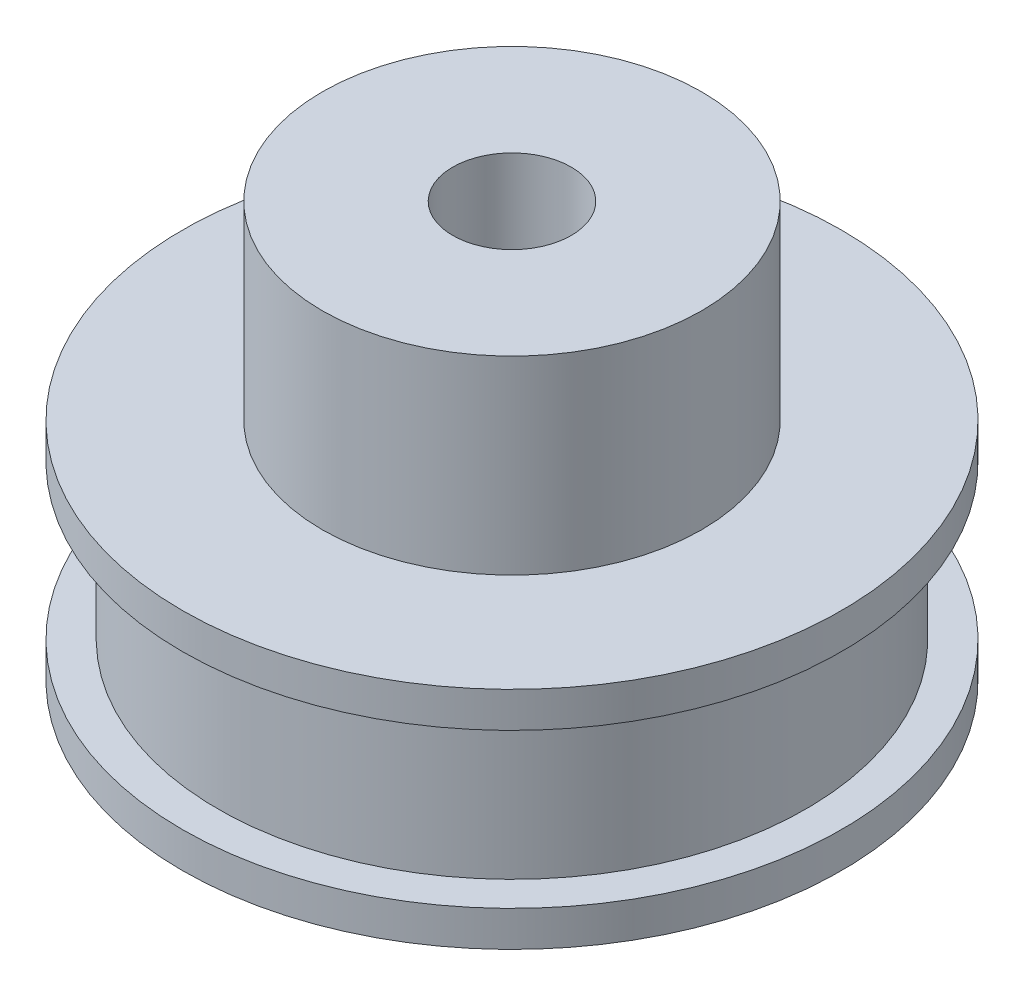
ISO-10303-21;
HEADER;
FILE_DESCRIPTION(('STEP AP214'),'2;1');
FILE_NAME('part.step','',(''),(''),'','','');
FILE_SCHEMA(('AUTOMOTIVE_DESIGN { 1 0 10303 214 1 1 1 1 }'));
ENDSEC;
DATA;
#1=APPLICATION_CONTEXT('core data for automotive mechanical design processes');
#2=APPLICATION_PROTOCOL_DEFINITION('international standard','automotive_design',2000,#1);
#3=PRODUCT_CONTEXT('',#1,'mechanical');
#4=PRODUCT('Part','Part','',(#3));
#5=PRODUCT_RELATED_PRODUCT_CATEGORY('part','',(#4));
#6=PRODUCT_DEFINITION_FORMATION('','',#4);
#7=PRODUCT_DEFINITION_CONTEXT('part definition',#1,'design');
#8=PRODUCT_DEFINITION('design','',#6,#7);
#9=PRODUCT_DEFINITION_SHAPE('','',#8);
#10=(LENGTH_UNIT() NAMED_UNIT(*) SI_UNIT(.MILLI.,.METRE.));
#11=(NAMED_UNIT(*) PLANE_ANGLE_UNIT() SI_UNIT($,.RADIAN.));
#12=(NAMED_UNIT(*) SI_UNIT($,.STERADIAN.) SOLID_ANGLE_UNIT());
#13=UNCERTAINTY_MEASURE_WITH_UNIT(LENGTH_MEASURE(1.E-05),#10,'distance_accuracy_value','');
#14=(GEOMETRIC_REPRESENTATION_CONTEXT(3) GLOBAL_UNCERTAINTY_ASSIGNED_CONTEXT((#13)) GLOBAL_UNIT_ASSIGNED_CONTEXT((#10,
#11,#12)) REPRESENTATION_CONTEXT('',''));
#15=CARTESIAN_POINT('',(0.,0.,0.));
#16=DIRECTION('',(0.,0.,1.));
#17=DIRECTION('',(1.,0.,0.));
#18=AXIS2_PLACEMENT_3D('',#15,#16,#17);
#19=CARTESIAN_POINT('',(8.85,17.5,0.));
#20=DIRECTION('',(0.,1.,0.));
#21=DIRECTION('',(0.,0.,1.));
#22=AXIS2_PLACEMENT_3D('',#19,#20,#21);
#23=PLANE('',#22);
#24=CARTESIAN_POINT('',(0.,17.5,0.));
#25=DIRECTION('',(0.,-1.,0.));
#26=DIRECTION('',(0.,0.,-1.));
#27=AXIS2_PLACEMENT_3D('',#24,#25,#26);
#28=CIRCLE('',#27,2.5);
#29=CARTESIAN_POINT('',(0.,17.5,-2.5));
#30=VERTEX_POINT('',#29);
#31=EDGE_CURVE('E60',#30,#30,#28,.T.);
#32=ORIENTED_EDGE('',*,*,#31,.T.);
#33=EDGE_LOOP('',(#32));
#34=FACE_BOUND('',#33,.T.);
#35=CARTESIAN_POINT('',(0.,17.5,0.));
#36=DIRECTION('',(0.,1.,0.));
#37=DIRECTION('',(0.,0.,1.));
#38=AXIS2_PLACEMENT_3D('',#35,#36,#37);
#39=CIRCLE('',#38,8.);
#40=CARTESIAN_POINT('',(0.,17.5,8.));
#41=VERTEX_POINT('',#40);
#42=EDGE_CURVE('E64',#41,#41,#39,.T.);
#43=ORIENTED_EDGE('',*,*,#42,.T.);
#44=EDGE_LOOP('',(#43));
#45=FACE_BOUND('',#44,.T.);
#46=ADVANCED_FACE('F31',(#34,#45),#23,.T.);
#47=CARTESIAN_POINT('',(0.,0.,0.));
#48=DIRECTION('',(0.,-1.,0.));
#49=DIRECTION('',(0.,0.,-1.));
#50=AXIS2_PLACEMENT_3D('',#47,#48,#49);
#51=CYLINDRICAL_SURFACE('',#50,2.5);
#52=CARTESIAN_POINT('',(0.,0.,0.));
#53=DIRECTION('',(0.,-1.,0.));
#54=DIRECTION('',(0.,0.,-1.));
#55=AXIS2_PLACEMENT_3D('',#52,#53,#54);
#56=CIRCLE('',#55,2.5);
#57=CARTESIAN_POINT('',(0.,0.,-2.5));
#58=VERTEX_POINT('',#57);
#59=EDGE_CURVE('E10',#58,#58,#56,.T.);
#60=ORIENTED_EDGE('',*,*,#59,.T.);
#61=EDGE_LOOP('',(#60));
#62=FACE_BOUND('',#61,.T.);
#63=ORIENTED_EDGE('',*,*,#31,.F.);
#64=EDGE_LOOP('',(#63));
#65=FACE_BOUND('',#64,.T.);
#66=ADVANCED_FACE('F33',(#62,#65),#51,.F.);
#67=CARTESIAN_POINT('',(2.5,0.,0.));
#68=DIRECTION('',(0.,-1.,0.));
#69=DIRECTION('',(0.,0.,-1.));
#70=AXIS2_PLACEMENT_3D('',#67,#68,#69);
#71=PLANE('',#70);
#72=CARTESIAN_POINT('',(0.,0.,0.));
#73=DIRECTION('',(0.,-1.,0.));
#74=DIRECTION('',(0.,0.,-1.));
#75=AXIS2_PLACEMENT_3D('',#72,#73,#74);
#76=CIRCLE('',#75,13.9);
#77=CARTESIAN_POINT('',(0.,0.,-13.9));
#78=VERTEX_POINT('',#77);
#79=EDGE_CURVE('E38',#78,#78,#76,.T.);
#80=ORIENTED_EDGE('',*,*,#79,.T.);
#81=EDGE_LOOP('',(#80));
#82=FACE_BOUND('',#81,.T.);
#83=ORIENTED_EDGE('',*,*,#59,.F.);
#84=EDGE_LOOP('',(#83));
#85=FACE_BOUND('',#84,.T.);
#86=ADVANCED_FACE('F95',(#82,#85),#71,.T.);
#87=CARTESIAN_POINT('',(0.,0.,0.));
#88=DIRECTION('',(0.,-1.,0.));
#89=DIRECTION('',(0.,0.,-1.));
#90=AXIS2_PLACEMENT_3D('',#87,#88,#89);
#91=CYLINDRICAL_SURFACE('',#90,13.9);
#92=CARTESIAN_POINT('',(0.,1.5,0.));
#93=DIRECTION('',(0.,-1.,0.));
#94=DIRECTION('',(0.,0.,-1.));
#95=AXIS2_PLACEMENT_3D('',#92,#93,#94);
#96=CIRCLE('',#95,13.9);
#97=CARTESIAN_POINT('',(0.,1.5,-13.9));
#98=VERTEX_POINT('',#97);
#99=EDGE_CURVE('E42',#98,#98,#96,.T.);
#100=ORIENTED_EDGE('',*,*,#99,.T.);
#101=EDGE_LOOP('',(#100));
#102=FACE_BOUND('',#101,.T.);
#103=ORIENTED_EDGE('',*,*,#79,.F.);
#104=EDGE_LOOP('',(#103));
#105=FACE_BOUND('',#104,.T.);
#106=ADVANCED_FACE('F103',(#102,#105),#91,.T.);
#107=CARTESIAN_POINT('',(13.9,1.5,0.));
#108=DIRECTION('',(0.,1.,0.));
#109=DIRECTION('',(0.,0.,1.));
#110=AXIS2_PLACEMENT_3D('',#107,#108,#109);
#111=PLANE('',#110);
#112=CARTESIAN_POINT('',(0.,1.5,0.));
#113=DIRECTION('',(0.,-1.,0.));
#114=DIRECTION('',(0.,0.,-1.));
#115=AXIS2_PLACEMENT_3D('',#112,#113,#114);
#116=CIRCLE('',#115,12.4);
#117=CARTESIAN_POINT('',(0.,1.5,-12.4));
#118=VERTEX_POINT('',#117);
#119=EDGE_CURVE('E46',#118,#118,#116,.T.);
#120=ORIENTED_EDGE('',*,*,#119,.T.);
#121=EDGE_LOOP('',(#120));
#122=FACE_BOUND('',#121,.T.);
#123=ORIENTED_EDGE('',*,*,#99,.F.);
#124=EDGE_LOOP('',(#123));
#125=FACE_BOUND('',#124,.T.);
#126=ADVANCED_FACE('F107',(#122,#125),#111,.T.);
#127=CARTESIAN_POINT('',(0.,0.,0.));
#128=DIRECTION('',(0.,-1.,0.));
#129=DIRECTION('',(0.,0.,-1.));
#130=AXIS2_PLACEMENT_3D('',#127,#128,#129);
#131=CYLINDRICAL_SURFACE('',#130,12.4);
#132=CARTESIAN_POINT('',(0.,8.,0.));
#133=DIRECTION('',(0.,-1.,0.));
#134=DIRECTION('',(0.,0.,-1.));
#135=AXIS2_PLACEMENT_3D('',#132,#133,#134);
#136=CIRCLE('',#135,12.4);
#137=CARTESIAN_POINT('',(0.,8.,-12.4));
#138=VERTEX_POINT('',#137);
#139=EDGE_CURVE('E51',#138,#138,#136,.T.);
#140=ORIENTED_EDGE('',*,*,#139,.T.);
#141=EDGE_LOOP('',(#140));
#142=FACE_BOUND('',#141,.T.);
#143=ORIENTED_EDGE('',*,*,#119,.F.);
#144=EDGE_LOOP('',(#143));
#145=FACE_BOUND('',#144,.T.);
#146=ADVANCED_FACE('F114',(#142,#145),#131,.T.);
#147=CARTESIAN_POINT('',(12.4,8.,0.));
#148=DIRECTION('',(0.,-1.,0.));
#149=DIRECTION('',(0.,0.,-1.));
#150=AXIS2_PLACEMENT_3D('',#147,#148,#149);
#151=PLANE('',#150);
#152=CARTESIAN_POINT('',(0.,8.,0.));
#153=DIRECTION('',(0.,-1.,0.));
#154=DIRECTION('',(0.,0.,-1.));
#155=AXIS2_PLACEMENT_3D('',#152,#153,#154);
#156=CIRCLE('',#155,13.9);
#157=CARTESIAN_POINT('',(0.,8.,-13.9));
#158=VERTEX_POINT('',#157);
#159=EDGE_CURVE('E54',#158,#158,#156,.T.);
#160=ORIENTED_EDGE('',*,*,#159,.T.);
#161=EDGE_LOOP('',(#160));
#162=FACE_BOUND('',#161,.T.);
#163=ORIENTED_EDGE('',*,*,#139,.F.);
#164=EDGE_LOOP('',(#163));
#165=FACE_BOUND('',#164,.T.);
#166=ADVANCED_FACE('F84',(#162,#165),#151,.T.);
#167=CARTESIAN_POINT('',(0.,0.,0.));
#168=DIRECTION('',(0.,-1.,0.));
#169=DIRECTION('',(0.,0.,-1.));
#170=AXIS2_PLACEMENT_3D('',#167,#168,#169);
#171=CYLINDRICAL_SURFACE('',#170,13.9);
#172=CARTESIAN_POINT('',(0.,9.5,0.));
#173=DIRECTION('',(0.,-1.,0.));
#174=DIRECTION('',(0.,0.,-1.));
#175=AXIS2_PLACEMENT_3D('',#172,#173,#174);
#176=CIRCLE('',#175,13.9);
#177=CARTESIAN_POINT('',(0.,9.5,-13.9));
#178=VERTEX_POINT('',#177);
#179=EDGE_CURVE('E57',#178,#178,#176,.T.);
#180=ORIENTED_EDGE('',*,*,#179,.T.);
#181=EDGE_LOOP('',(#180));
#182=FACE_BOUND('',#181,.T.);
#183=ORIENTED_EDGE('',*,*,#159,.F.);
#184=EDGE_LOOP('',(#183));
#185=FACE_BOUND('',#184,.T.);
#186=ADVANCED_FACE('F75',(#182,#185),#171,.T.);
#187=CARTESIAN_POINT('',(13.9,9.5,0.));
#188=DIRECTION('',(0.,1.,0.));
#189=DIRECTION('',(0.,0.,1.));
#190=AXIS2_PLACEMENT_3D('',#187,#188,#189);
#191=PLANE('',#190);
#192=ORIENTED_EDGE('',*,*,#179,.F.);
#193=EDGE_LOOP('',(#192));
#194=FACE_BOUND('',#193,.T.);
#195=CARTESIAN_POINT('',(0.,9.5,0.));
#196=DIRECTION('',(0.,1.,0.));
#197=DIRECTION('',(0.,0.,1.));
#198=AXIS2_PLACEMENT_3D('',#195,#196,#197);
#199=CIRCLE('',#198,8.);
#200=CARTESIAN_POINT('',(0.,9.5,8.));
#201=VERTEX_POINT('',#200);
#202=EDGE_CURVE('E63',#201,#201,#199,.T.);
#203=ORIENTED_EDGE('',*,*,#202,.F.);
#204=EDGE_LOOP('',(#203));
#205=FACE_BOUND('',#204,.T.);
#206=ADVANCED_FACE('F73',(#194,#205),#191,.T.);
#207=CARTESIAN_POINT('',(0.,9.5,0.));
#208=DIRECTION('',(0.,1.,0.));
#209=DIRECTION('',(0.,0.,1.));
#210=AXIS2_PLACEMENT_3D('',#207,#208,#209);
#211=CYLINDRICAL_SURFACE('',#210,8.);
#212=ORIENTED_EDGE('',*,*,#202,.T.);
#213=EDGE_LOOP('',(#212));
#214=FACE_BOUND('',#213,.T.);
#215=ORIENTED_EDGE('',*,*,#42,.F.);
#216=EDGE_LOOP('',(#215));
#217=FACE_BOUND('',#216,.T.);
#218=ADVANCED_FACE('F70',(#214,#217),#211,.T.);
#219=CLOSED_SHELL('',(#46,#66,#86,#106,#126,#146,#166,#186,#206,#218));
#220=MANIFOLD_SOLID_BREP('B2',#219);
#221=ADVANCED_BREP_SHAPE_REPRESENTATION('',(#18,#220),#14);
#222=SHAPE_DEFINITION_REPRESENTATION(#9,#221);
ENDSEC;
END-ISO-10303-21;
